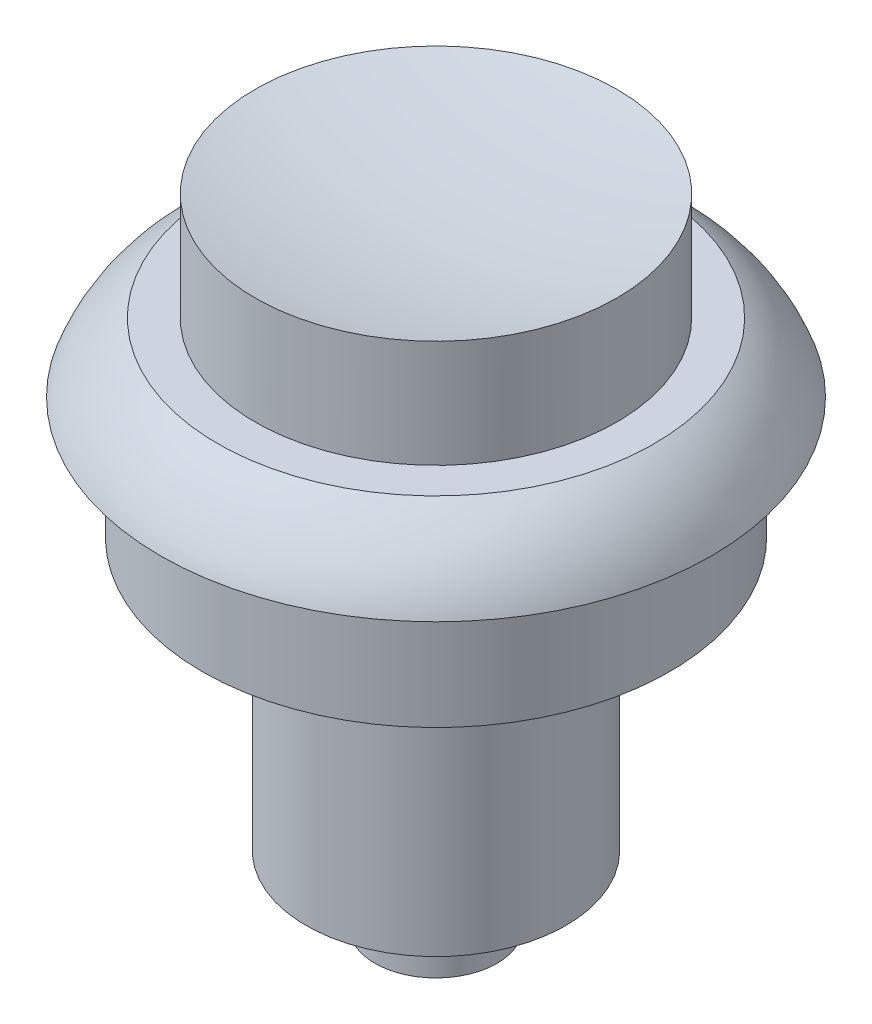
ISO-10303-21;
HEADER;
FILE_DESCRIPTION(('STEP AP214'),'2;1');
FILE_NAME('part.step','',(''),(''),'','','');
FILE_SCHEMA(('AUTOMOTIVE_DESIGN { 1 0 10303 214 1 1 1 1 }'));
ENDSEC;
DATA;
#1=APPLICATION_CONTEXT('core data for automotive mechanical design processes');
#2=APPLICATION_PROTOCOL_DEFINITION('international standard','automotive_design',2000,#1);
#3=PRODUCT_CONTEXT('',#1,'mechanical');
#4=PRODUCT('Part','Part','',(#3));
#5=PRODUCT_RELATED_PRODUCT_CATEGORY('part','',(#4));
#6=PRODUCT_DEFINITION_FORMATION('','',#4);
#7=PRODUCT_DEFINITION_CONTEXT('part definition',#1,'design');
#8=PRODUCT_DEFINITION('design','',#6,#7);
#9=PRODUCT_DEFINITION_SHAPE('','',#8);
#10=(LENGTH_UNIT() NAMED_UNIT(*) SI_UNIT(.MILLI.,.METRE.));
#11=(NAMED_UNIT(*) PLANE_ANGLE_UNIT() SI_UNIT($,.RADIAN.));
#12=(NAMED_UNIT(*) SI_UNIT($,.STERADIAN.) SOLID_ANGLE_UNIT());
#13=UNCERTAINTY_MEASURE_WITH_UNIT(LENGTH_MEASURE(1.E-05),#10,'distance_accuracy_value','');
#14=(GEOMETRIC_REPRESENTATION_CONTEXT(3) GLOBAL_UNCERTAINTY_ASSIGNED_CONTEXT((#13)) GLOBAL_UNIT_ASSIGNED_CONTEXT((#10,
#11,#12)) REPRESENTATION_CONTEXT('',''));
#15=CARTESIAN_POINT('',(0.,0.,0.));
#16=DIRECTION('',(0.,0.,1.));
#17=DIRECTION('',(1.,0.,0.));
#18=AXIS2_PLACEMENT_3D('',#15,#16,#17);
#19=CARTESIAN_POINT('',(0.,0.,0.));
#20=DIRECTION('',(0.,-1.,0.));
#21=DIRECTION('',(0.,0.,-1.));
#22=AXIS2_PLACEMENT_3D('',#19,#20,#21);
#23=PLANE('',#22);
#24=CARTESIAN_POINT('',(0.,0.,0.));
#25=DIRECTION('',(0.,-1.,0.));
#26=DIRECTION('',(0.,0.,-1.));
#27=AXIS2_PLACEMENT_3D('',#24,#25,#26);
#28=CIRCLE('',#27,1.905);
#29=CARTESIAN_POINT('',(0.,0.,-1.905));
#30=VERTEX_POINT('',#29);
#31=EDGE_CURVE('E85',#30,#30,#28,.T.);
#32=ORIENTED_EDGE('',*,*,#31,.F.);
#33=EDGE_LOOP('',(#32));
#34=FACE_BOUND('',#33,.T.);
#35=CARTESIAN_POINT('',(0.,0.,0.));
#36=DIRECTION('',(0.,-1.,0.));
#37=DIRECTION('',(0.,0.,-1.));
#38=AXIS2_PLACEMENT_3D('',#35,#36,#37);
#39=CIRCLE('',#38,3.7338);
#40=CARTESIAN_POINT('',(0.,0.,-3.7338));
#41=VERTEX_POINT('',#40);
#42=EDGE_CURVE('E10',#41,#41,#39,.T.);
#43=ORIENTED_EDGE('',*,*,#42,.T.);
#44=EDGE_LOOP('',(#43));
#45=FACE_BOUND('',#44,.T.);
#46=ADVANCED_FACE('F37',(#34,#45),#23,.T.);
#47=CARTESIAN_POINT('',(0.,0.,0.));
#48=DIRECTION('',(0.,-1.,0.));
#49=DIRECTION('',(0.,0.,-1.));
#50=AXIS2_PLACEMENT_3D('',#47,#48,#49);
#51=CYLINDRICAL_SURFACE('',#50,3.7338);
#52=CARTESIAN_POINT('',(0.,4.1021,0.));
#53=DIRECTION('',(0.,-1.,0.));
#54=DIRECTION('',(0.,0.,-1.));
#55=AXIS2_PLACEMENT_3D('',#52,#53,#54);
#56=CIRCLE('',#55,3.7338);
#57=CARTESIAN_POINT('',(0.,4.1021,-3.7338));
#58=VERTEX_POINT('',#57);
#59=EDGE_CURVE('E44',#58,#58,#56,.T.);
#60=ORIENTED_EDGE('',*,*,#59,.T.);
#61=EDGE_LOOP('',(#60));
#62=FACE_BOUND('',#61,.T.);
#63=ORIENTED_EDGE('',*,*,#42,.F.);
#64=EDGE_LOOP('',(#63));
#65=FACE_BOUND('',#64,.T.);
#66=ADVANCED_FACE('F103',(#62,#65),#51,.T.);
#67=CARTESIAN_POINT('',(3.7338,4.1021,0.));
#68=DIRECTION('',(0.,-1.,0.));
#69=DIRECTION('',(0.,0.,-1.));
#70=AXIS2_PLACEMENT_3D('',#67,#68,#69);
#71=PLANE('',#70);
#72=CARTESIAN_POINT('',(0.,4.1021,0.));
#73=DIRECTION('',(0.,-1.,0.));
#74=DIRECTION('',(0.,0.,-1.));
#75=AXIS2_PLACEMENT_3D('',#72,#73,#74);
#76=CIRCLE('',#75,7.9375);
#77=CARTESIAN_POINT('',(0.,4.1021,-7.9375));
#78=VERTEX_POINT('',#77);
#79=EDGE_CURVE('E49',#78,#78,#76,.T.);
#80=ORIENTED_EDGE('',*,*,#79,.T.);
#81=EDGE_LOOP('',(#80));
#82=FACE_BOUND('',#81,.T.);
#83=ORIENTED_EDGE('',*,*,#59,.F.);
#84=EDGE_LOOP('',(#83));
#85=FACE_BOUND('',#84,.T.);
#86=ADVANCED_FACE('F107',(#82,#85),#71,.T.);
#87=CARTESIAN_POINT('',(0.,0.,0.));
#88=DIRECTION('',(0.,-1.,0.));
#89=DIRECTION('',(0.,0.,-1.));
#90=AXIS2_PLACEMENT_3D('',#87,#88,#89);
#91=CYLINDRICAL_SURFACE('',#90,7.9375);
#92=CARTESIAN_POINT('',(0.,20.7137,0.));
#93=DIRECTION('',(0.,-1.,0.));
#94=DIRECTION('',(0.,0.,-1.));
#95=AXIS2_PLACEMENT_3D('',#92,#93,#94);
#96=CIRCLE('',#95,7.9375);
#97=CARTESIAN_POINT('',(0.,20.7137,-7.9375));
#98=VERTEX_POINT('',#97);
#99=EDGE_CURVE('E54',#98,#98,#96,.T.);
#100=ORIENTED_EDGE('',*,*,#99,.T.);
#101=EDGE_LOOP('',(#100));
#102=FACE_BOUND('',#101,.T.);
#103=ORIENTED_EDGE('',*,*,#79,.F.);
#104=EDGE_LOOP('',(#103));
#105=FACE_BOUND('',#104,.T.);
#106=ADVANCED_FACE('F111',(#102,#105),#91,.T.);
#107=CARTESIAN_POINT('',(7.9375,20.7137,0.));
#108=DIRECTION('',(0.,-1.,0.));
#109=DIRECTION('',(0.,0.,-1.));
#110=AXIS2_PLACEMENT_3D('',#107,#108,#109);
#111=PLANE('',#110);
#112=CARTESIAN_POINT('',(0.,20.7137,0.));
#113=DIRECTION('',(0.,-1.,0.));
#114=DIRECTION('',(0.,0.,-1.));
#115=AXIS2_PLACEMENT_3D('',#112,#113,#114);
#116=CIRCLE('',#115,14.2875);
#117=CARTESIAN_POINT('',(0.,20.7137,-14.2875));
#118=VERTEX_POINT('',#117);
#119=EDGE_CURVE('E60',#118,#118,#116,.T.);
#120=ORIENTED_EDGE('',*,*,#119,.T.);
#121=EDGE_LOOP('',(#120));
#122=FACE_BOUND('',#121,.T.);
#123=ORIENTED_EDGE('',*,*,#99,.F.);
#124=EDGE_LOOP('',(#123));
#125=FACE_BOUND('',#124,.T.);
#126=ADVANCED_FACE('F118',(#122,#125),#111,.T.);
#127=CARTESIAN_POINT('',(0.,0.,0.));
#128=DIRECTION('',(0.,-1.,0.));
#129=DIRECTION('',(0.,0.,-1.));
#130=AXIS2_PLACEMENT_3D('',#127,#128,#129);
#131=CYLINDRICAL_SURFACE('',#130,14.2875);
#132=CARTESIAN_POINT('',(0.,28.1051,0.));
#133=DIRECTION('',(0.,-1.,0.));
#134=DIRECTION('',(0.,0.,-1.));
#135=AXIS2_PLACEMENT_3D('',#132,#133,#134);
#136=CIRCLE('',#135,14.2875);
#137=CARTESIAN_POINT('',(0.,28.1051,-14.2875));
#138=VERTEX_POINT('',#137);
#139=EDGE_CURVE('E64',#138,#138,#136,.T.);
#140=ORIENTED_EDGE('',*,*,#139,.T.);
#141=EDGE_LOOP('',(#140));
#142=FACE_BOUND('',#141,.T.);
#143=ORIENTED_EDGE('',*,*,#119,.F.);
#144=EDGE_LOOP('',(#143));
#145=FACE_BOUND('',#144,.T.);
#146=ADVANCED_FACE('F122',(#142,#145),#131,.T.);
#147=CARTESIAN_POINT('',(14.2875,28.1051,0.));
#148=DIRECTION('',(0.,-1.,0.));
#149=DIRECTION('',(0.,0.,-1.));
#150=AXIS2_PLACEMENT_3D('',#147,#148,#149);
#151=PLANE('',#150);
#152=CARTESIAN_POINT('',(0.,28.1051,0.));
#153=DIRECTION('',(0.,-1.,0.));
#154=DIRECTION('',(0.,0.,-1.));
#155=AXIS2_PLACEMENT_3D('',#152,#153,#154);
#156=CIRCLE('',#155,16.8275);
#157=CARTESIAN_POINT('',(0.,28.1051,-16.8275));
#158=VERTEX_POINT('',#157);
#159=EDGE_CURVE('E68',#158,#158,#156,.T.);
#160=ORIENTED_EDGE('',*,*,#159,.T.);
#161=EDGE_LOOP('',(#160));
#162=FACE_BOUND('',#161,.T.);
#163=ORIENTED_EDGE('',*,*,#139,.F.);
#164=EDGE_LOOP('',(#163));
#165=FACE_BOUND('',#164,.T.);
#166=ADVANCED_FACE('F126',(#162,#165),#151,.T.);
#167=CARTESIAN_POINT('',(0.,25.4286104787648,0.));
#168=DIRECTION('',(0.,-1.,0.));
#169=DIRECTION('',(0.,0.,-1.));
#170=AXIS2_PLACEMENT_3D('',#167,#168,#169);
#171=TOROIDAL_SURFACE('',#170,9.35486257451774,7.9375);
#172=CARTESIAN_POINT('',(0.,32.2961,0.));
#173=DIRECTION('',(0.,-1.,0.));
#174=DIRECTION('',(0.,0.,-1.));
#175=AXIS2_PLACEMENT_3D('',#172,#173,#174);
#176=CIRCLE('',#175,13.335);
#177=CARTESIAN_POINT('',(0.,32.2961,-13.335));
#178=VERTEX_POINT('',#177);
#179=EDGE_CURVE('E72',#178,#178,#176,.T.);
#180=ORIENTED_EDGE('',*,*,#179,.T.);
#181=EDGE_LOOP('',(#180));
#182=FACE_BOUND('',#181,.T.);
#183=ORIENTED_EDGE('',*,*,#159,.F.);
#184=EDGE_LOOP('',(#183));
#185=FACE_BOUND('',#184,.T.);
#186=ADVANCED_FACE('F130',(#182,#185),#171,.T.);
#187=CARTESIAN_POINT('',(13.335,32.2961,0.));
#188=DIRECTION('',(0.,1.,0.));
#189=DIRECTION('',(0.,0.,1.));
#190=AXIS2_PLACEMENT_3D('',#187,#188,#189);
#191=PLANE('',#190);
#192=CARTESIAN_POINT('',(0.,32.2961,0.));
#193=DIRECTION('',(0.,-1.,0.));
#194=DIRECTION('',(0.,0.,-1.));
#195=AXIS2_PLACEMENT_3D('',#192,#193,#194);
#196=CIRCLE('',#195,11.049);
#197=CARTESIAN_POINT('',(0.,32.2961,-11.049));
#198=VERTEX_POINT('',#197);
#199=EDGE_CURVE('E76',#198,#198,#196,.T.);
#200=ORIENTED_EDGE('',*,*,#199,.T.);
#201=EDGE_LOOP('',(#200));
#202=FACE_BOUND('',#201,.T.);
#203=ORIENTED_EDGE('',*,*,#179,.F.);
#204=EDGE_LOOP('',(#203));
#205=FACE_BOUND('',#204,.T.);
#206=ADVANCED_FACE('F134',(#202,#205),#191,.T.);
#207=CARTESIAN_POINT('',(0.,0.,0.));
#208=DIRECTION('',(0.,-1.,0.));
#209=DIRECTION('',(0.,0.,-1.));
#210=AXIS2_PLACEMENT_3D('',#207,#208,#209);
#211=CYLINDRICAL_SURFACE('',#210,11.049);
#212=CARTESIAN_POINT('',(0.,38.862,0.));
#213=DIRECTION('',(0.,-1.,0.));
#214=DIRECTION('',(0.,0.,-1.));
#215=AXIS2_PLACEMENT_3D('',#212,#213,#214);
#216=CIRCLE('',#215,11.049);
#217=CARTESIAN_POINT('',(0.,38.862,-11.049));
#218=VERTEX_POINT('',#217);
#219=EDGE_CURVE('E80',#218,#218,#216,.T.);
#220=ORIENTED_EDGE('',*,*,#219,.T.);
#221=EDGE_LOOP('',(#220));
#222=FACE_BOUND('',#221,.T.);
#223=ORIENTED_EDGE('',*,*,#199,.F.);
#224=EDGE_LOOP('',(#223));
#225=FACE_BOUND('',#224,.T.);
#226=ADVANCED_FACE('F138',(#222,#225),#211,.T.);
#227=CARTESIAN_POINT('',(0.,86.29015,0.));
#228=DIRECTION('',(0.,-1.,0.));
#229=DIRECTION('',(1.,0.,0.));
#230=AXIS2_PLACEMENT_3D('',#227,#228,#229);
#231=SPHERICAL_SURFACE('',#230,48.69815);
#232=ORIENTED_EDGE('',*,*,#219,.F.);
#233=EDGE_LOOP('',(#232));
#234=FACE_BOUND('',#233,.T.);
#235=ADVANCED_FACE('F98',(#234),#231,.F.);
#236=CARTESIAN_POINT('',(0.,3.3782,0.));
#237=DIRECTION('',(0.,-1.,0.));
#238=DIRECTION('',(0.,0.,-1.));
#239=AXIS2_PLACEMENT_3D('',#236,#237,#238);
#240=CYLINDRICAL_SURFACE('',#239,1.905);
#241=CARTESIAN_POINT('',(0.,3.3782,0.));
#242=DIRECTION('',(0.,-1.,0.));
#243=DIRECTION('',(0.,0.,-1.));
#244=AXIS2_PLACEMENT_3D('',#241,#242,#243);
#245=CIRCLE('',#244,1.905);
#246=CARTESIAN_POINT('',(0.,3.3782,-1.905));
#247=VERTEX_POINT('',#246);
#248=EDGE_CURVE('E84',#247,#247,#245,.T.);
#249=ORIENTED_EDGE('',*,*,#248,.F.);
#250=EDGE_LOOP('',(#249));
#251=FACE_BOUND('',#250,.T.);
#252=ORIENTED_EDGE('',*,*,#31,.T.);
#253=EDGE_LOOP('',(#252));
#254=FACE_BOUND('',#253,.T.);
#255=ADVANCED_FACE('F95',(#251,#254),#240,.F.);
#256=CARTESIAN_POINT('',(0.,3.3782,0.));
#257=DIRECTION('',(0.,-1.,0.));
#258=DIRECTION('',(0.,0.,-1.));
#259=AXIS2_PLACEMENT_3D('',#256,#257,#258);
#260=PLANE('',#259);
#261=ORIENTED_EDGE('',*,*,#248,.T.);
#262=EDGE_LOOP('',(#261));
#263=FACE_BOUND('',#262,.T.);
#264=ADVANCED_FACE('F93',(#263),#260,.T.);
#265=CLOSED_SHELL('',(#46,#66,#86,#106,#126,#146,#166,#186,#206,#226,#235,#255,#264));
#266=MANIFOLD_SOLID_BREP('B2',#265);
#267=ADVANCED_BREP_SHAPE_REPRESENTATION('',(#18,#266),#14);
#268=SHAPE_DEFINITION_REPRESENTATION(#9,#267);
ENDSEC;
END-ISO-10303-21;
